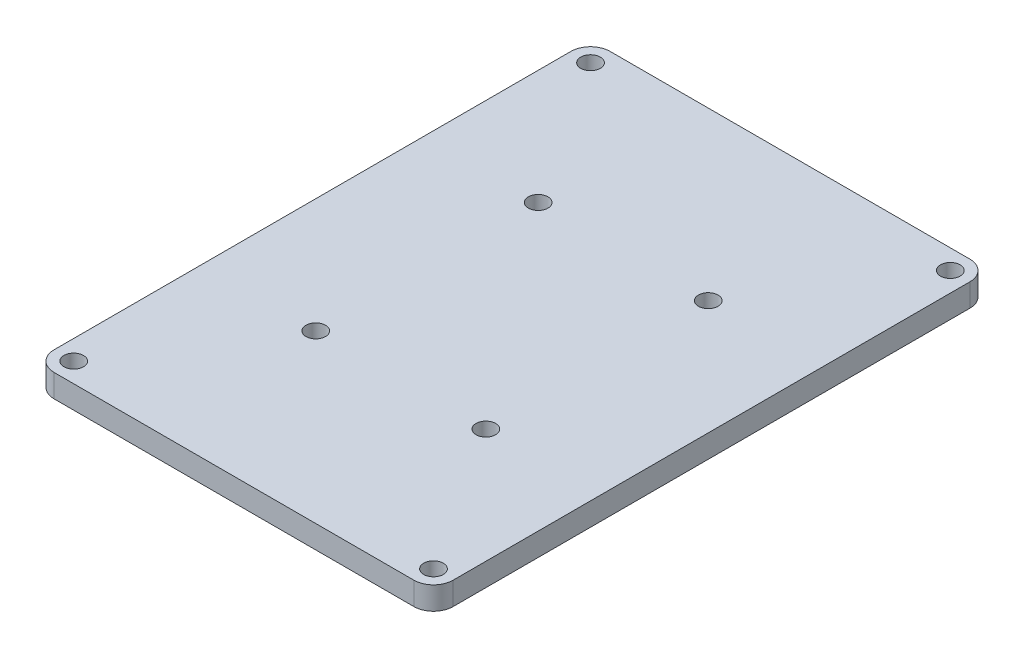
ISO-10303-21;
HEADER;
FILE_DESCRIPTION(('STEP AP214'),'2;1');
FILE_NAME('part.step','',(''),(''),'','','');
FILE_SCHEMA(('AUTOMOTIVE_DESIGN { 1 0 10303 214 1 1 1 1 }'));
ENDSEC;
DATA;
#1=APPLICATION_CONTEXT('core data for automotive mechanical design processes');
#2=APPLICATION_PROTOCOL_DEFINITION('international standard','automotive_design',2000,#1);
#3=PRODUCT_CONTEXT('',#1,'mechanical');
#4=PRODUCT('Part','Part','',(#3));
#5=PRODUCT_RELATED_PRODUCT_CATEGORY('part','',(#4));
#6=PRODUCT_DEFINITION_FORMATION('','',#4);
#7=PRODUCT_DEFINITION_CONTEXT('part definition',#1,'design');
#8=PRODUCT_DEFINITION('design','',#6,#7);
#9=PRODUCT_DEFINITION_SHAPE('','',#8);
#10=(LENGTH_UNIT() NAMED_UNIT(*) SI_UNIT(.MILLI.,.METRE.));
#11=(NAMED_UNIT(*) PLANE_ANGLE_UNIT() SI_UNIT($,.RADIAN.));
#12=(NAMED_UNIT(*) SI_UNIT($,.STERADIAN.) SOLID_ANGLE_UNIT());
#13=UNCERTAINTY_MEASURE_WITH_UNIT(LENGTH_MEASURE(1.E-05),#10,'distance_accuracy_value','');
#14=(GEOMETRIC_REPRESENTATION_CONTEXT(3) GLOBAL_UNCERTAINTY_ASSIGNED_CONTEXT((#13)) GLOBAL_UNIT_ASSIGNED_CONTEXT((#10,
#11,#12)) REPRESENTATION_CONTEXT('',''));
#15=CARTESIAN_POINT('',(0.,0.,0.));
#16=DIRECTION('',(0.,0.,1.));
#17=DIRECTION('',(1.,0.,0.));
#18=AXIS2_PLACEMENT_3D('',#15,#16,#17);
#19=CARTESIAN_POINT('',(30.5,3.5,-42.5));
#20=DIRECTION('',(-1.,0.,0.));
#21=DIRECTION('',(0.,0.,1.));
#22=AXIS2_PLACEMENT_3D('',#19,#20,#21);
#23=PLANE('',#22);
#24=DIRECTION('',(0.,0.,-1.));
#25=VECTOR('',#24,1.);
#26=CARTESIAN_POINT('',(30.5,0.,-42.5));
#27=LINE('',#26,#25);
#28=CARTESIAN_POINT('',(30.5,0.,39.5));
#29=VERTEX_POINT('',#28);
#30=CARTESIAN_POINT('',(30.5,0.,-39.5));
#31=VERTEX_POINT('',#30);
#32=EDGE_CURVE('E128',#29,#31,#27,.T.);
#33=ORIENTED_EDGE('',*,*,#32,.T.);
#34=DIRECTION('',(0.,-1.,0.));
#35=VECTOR('',#34,1.);
#36=CARTESIAN_POINT('',(30.5,3.5,-39.5));
#37=LINE('',#36,#35);
#38=CARTESIAN_POINT('',(30.5,3.5,-39.5));
#39=VERTEX_POINT('',#38);
#40=EDGE_CURVE('E151',#31,#39,#37,.F.);
#41=ORIENTED_EDGE('',*,*,#40,.T.);
#42=DIRECTION('',(0.,0.,-1.));
#43=VECTOR('',#42,1.);
#44=CARTESIAN_POINT('',(30.5,3.5,-42.5));
#45=LINE('',#44,#43);
#46=CARTESIAN_POINT('',(30.5,3.5,39.5));
#47=VERTEX_POINT('',#46);
#48=EDGE_CURVE('E126',#47,#39,#45,.T.);
#49=ORIENTED_EDGE('',*,*,#48,.F.);
#50=DIRECTION('',(0.,-1.,0.));
#51=VECTOR('',#50,1.);
#52=CARTESIAN_POINT('',(30.5,3.5,39.5));
#53=LINE('',#52,#51);
#54=EDGE_CURVE('E148',#47,#29,#53,.T.);
#55=ORIENTED_EDGE('',*,*,#54,.T.);
#56=EDGE_LOOP('',(#33,#41,#49,#55));
#57=FACE_BOUND('',#56,.T.);
#58=ADVANCED_FACE('F33',(#57),#23,.F.);
#59=CARTESIAN_POINT('',(-30.5,3.5,-42.5));
#60=DIRECTION('',(0.,0.,1.));
#61=DIRECTION('',(1.,0.,0.));
#62=AXIS2_PLACEMENT_3D('',#59,#60,#61);
#63=PLANE('',#62);
#64=DIRECTION('',(-1.,0.,0.));
#65=VECTOR('',#64,1.);
#66=CARTESIAN_POINT('',(-30.5,0.,-42.5));
#67=LINE('',#66,#65);
#68=CARTESIAN_POINT('',(27.5,0.,-42.5));
#69=VERTEX_POINT('',#68);
#70=CARTESIAN_POINT('',(-27.5,0.,-42.5));
#71=VERTEX_POINT('',#70);
#72=EDGE_CURVE('E124',#69,#71,#67,.T.);
#73=ORIENTED_EDGE('',*,*,#72,.T.);
#74=DIRECTION('',(0.,-1.,0.));
#75=VECTOR('',#74,1.);
#76=CARTESIAN_POINT('',(-27.5,3.5,-42.5));
#77=LINE('',#76,#75);
#78=CARTESIAN_POINT('',(-27.5,3.5,-42.5));
#79=VERTEX_POINT('',#78);
#80=EDGE_CURVE('E103',#71,#79,#77,.F.);
#81=ORIENTED_EDGE('',*,*,#80,.T.);
#82=DIRECTION('',(-1.,0.,0.));
#83=VECTOR('',#82,1.);
#84=CARTESIAN_POINT('',(-30.5,3.5,-42.5));
#85=LINE('',#84,#83);
#86=CARTESIAN_POINT('',(27.5,3.5,-42.5));
#87=VERTEX_POINT('',#86);
#88=EDGE_CURVE('E167',#87,#79,#85,.T.);
#89=ORIENTED_EDGE('',*,*,#88,.F.);
#90=DIRECTION('',(0.,-1.,0.));
#91=VECTOR('',#90,1.);
#92=CARTESIAN_POINT('',(27.5,3.5,-42.5));
#93=LINE('',#92,#91);
#94=EDGE_CURVE('E108',#87,#69,#93,.T.);
#95=ORIENTED_EDGE('',*,*,#94,.T.);
#96=EDGE_LOOP('',(#73,#81,#89,#95));
#97=FACE_BOUND('',#96,.T.);
#98=ADVANCED_FACE('F252',(#97),#63,.F.);
#99=CARTESIAN_POINT('',(-30.5,3.5,-42.5));
#100=DIRECTION('',(1.,0.,0.));
#101=DIRECTION('',(0.,0.,-1.));
#102=AXIS2_PLACEMENT_3D('',#99,#100,#101);
#103=PLANE('',#102);
#104=DIRECTION('',(0.,0.,1.));
#105=VECTOR('',#104,1.);
#106=CARTESIAN_POINT('',(-30.5,3.5,-42.5));
#107=LINE('',#106,#105);
#108=CARTESIAN_POINT('',(-30.5,3.5,-39.5));
#109=VERTEX_POINT('',#108);
#110=CARTESIAN_POINT('',(-30.5,3.5,39.5));
#111=VERTEX_POINT('',#110);
#112=EDGE_CURVE('E117',#109,#111,#107,.T.);
#113=ORIENTED_EDGE('',*,*,#112,.F.);
#114=DIRECTION('',(0.,-1.,0.));
#115=VECTOR('',#114,1.);
#116=CARTESIAN_POINT('',(-30.5,3.5,-39.5));
#117=LINE('',#116,#115);
#118=CARTESIAN_POINT('',(-30.5,0.,-39.5));
#119=VERTEX_POINT('',#118);
#120=EDGE_CURVE('E102',#109,#119,#117,.T.);
#121=ORIENTED_EDGE('',*,*,#120,.T.);
#122=DIRECTION('',(0.,0.,1.));
#123=VECTOR('',#122,1.);
#124=CARTESIAN_POINT('',(-30.5,0.,-42.5));
#125=LINE('',#124,#123);
#126=CARTESIAN_POINT('',(-30.5,0.,39.5));
#127=VERTEX_POINT('',#126);
#128=EDGE_CURVE('E115',#119,#127,#125,.T.);
#129=ORIENTED_EDGE('',*,*,#128,.T.);
#130=DIRECTION('',(0.,-1.,0.));
#131=VECTOR('',#130,1.);
#132=CARTESIAN_POINT('',(-30.5,3.5,39.5));
#133=LINE('',#132,#131);
#134=EDGE_CURVE('E119',#127,#111,#133,.F.);
#135=ORIENTED_EDGE('',*,*,#134,.T.);
#136=EDGE_LOOP('',(#113,#121,#129,#135));
#137=FACE_BOUND('',#136,.T.);
#138=ADVANCED_FACE('F114',(#137),#103,.F.);
#139=CARTESIAN_POINT('',(-30.5,3.5,42.5));
#140=DIRECTION('',(0.,0.,-1.));
#141=DIRECTION('',(-1.,0.,0.));
#142=AXIS2_PLACEMENT_3D('',#139,#140,#141);
#143=PLANE('',#142);
#144=DIRECTION('',(1.,0.,0.));
#145=VECTOR('',#144,1.);
#146=CARTESIAN_POINT('',(-30.5,0.,42.5));
#147=LINE('',#146,#145);
#148=CARTESIAN_POINT('',(-27.5,0.,42.5));
#149=VERTEX_POINT('',#148);
#150=CARTESIAN_POINT('',(27.5,0.,42.5));
#151=VERTEX_POINT('',#150);
#152=EDGE_CURVE('E123',#149,#151,#147,.T.);
#153=ORIENTED_EDGE('',*,*,#152,.T.);
#154=DIRECTION('',(0.,-1.,0.));
#155=VECTOR('',#154,1.);
#156=CARTESIAN_POINT('',(27.5,3.5,42.5));
#157=LINE('',#156,#155);
#158=CARTESIAN_POINT('',(27.5,3.5,42.5));
#159=VERTEX_POINT('',#158);
#160=EDGE_CURVE('E11',#151,#159,#157,.F.);
#161=ORIENTED_EDGE('',*,*,#160,.T.);
#162=DIRECTION('',(1.,0.,0.));
#163=VECTOR('',#162,1.);
#164=CARTESIAN_POINT('',(-30.5,3.5,42.5));
#165=LINE('',#164,#163);
#166=CARTESIAN_POINT('',(-27.5,3.5,42.5));
#167=VERTEX_POINT('',#166);
#168=EDGE_CURVE('E132',#167,#159,#165,.T.);
#169=ORIENTED_EDGE('',*,*,#168,.F.);
#170=DIRECTION('',(0.,-1.,0.));
#171=VECTOR('',#170,1.);
#172=CARTESIAN_POINT('',(-27.5,3.5,42.5));
#173=LINE('',#172,#171);
#174=EDGE_CURVE('E41',#167,#149,#173,.T.);
#175=ORIENTED_EDGE('',*,*,#174,.T.);
#176=EDGE_LOOP('',(#153,#161,#169,#175));
#177=FACE_BOUND('',#176,.T.);
#178=ADVANCED_FACE('F154',(#177),#143,.F.);
#179=CARTESIAN_POINT('',(0.,3.5,0.));
#180=DIRECTION('',(0.,1.,0.));
#181=DIRECTION('',(0.,0.,1.));
#182=AXIS2_PLACEMENT_3D('',#179,#180,#181);
#183=PLANE('',#182);
#184=CARTESIAN_POINT('',(-13.,3.5,17.));
#185=DIRECTION('',(0.,1.,0.));
#186=DIRECTION('',(0.,0.,1.));
#187=AXIS2_PLACEMENT_3D('',#184,#185,#186);
#188=CIRCLE('',#187,1.5);
#189=CARTESIAN_POINT('',(-13.,3.5,18.5));
#190=VERTEX_POINT('',#189);
#191=EDGE_CURVE('E207',#190,#190,#188,.T.);
#192=ORIENTED_EDGE('',*,*,#191,.F.);
#193=EDGE_LOOP('',(#192));
#194=FACE_BOUND('',#193,.T.);
#195=CARTESIAN_POINT('',(13.,3.5,-17.));
#196=DIRECTION('',(0.,1.,0.));
#197=DIRECTION('',(0.,0.,1.));
#198=AXIS2_PLACEMENT_3D('',#195,#196,#197);
#199=CIRCLE('',#198,1.5);
#200=CARTESIAN_POINT('',(13.,3.5,-15.5));
#201=VERTEX_POINT('',#200);
#202=EDGE_CURVE('E213',#201,#201,#199,.T.);
#203=ORIENTED_EDGE('',*,*,#202,.F.);
#204=EDGE_LOOP('',(#203));
#205=FACE_BOUND('',#204,.T.);
#206=CARTESIAN_POINT('',(13.,3.5,17.));
#207=DIRECTION('',(0.,1.,0.));
#208=DIRECTION('',(0.,0.,1.));
#209=AXIS2_PLACEMENT_3D('',#206,#207,#208);
#210=CIRCLE('',#209,1.5);
#211=CARTESIAN_POINT('',(13.,3.5,18.5));
#212=VERTEX_POINT('',#211);
#213=EDGE_CURVE('E219',#212,#212,#210,.T.);
#214=ORIENTED_EDGE('',*,*,#213,.F.);
#215=EDGE_LOOP('',(#214));
#216=FACE_BOUND('',#215,.T.);
#217=CARTESIAN_POINT('',(-13.,3.5,-17.));
#218=DIRECTION('',(0.,1.,0.));
#219=DIRECTION('',(0.,0.,1.));
#220=AXIS2_PLACEMENT_3D('',#217,#218,#219);
#221=CIRCLE('',#220,1.5);
#222=CARTESIAN_POINT('',(-13.,3.5,-15.5));
#223=VERTEX_POINT('',#222);
#224=EDGE_CURVE('E201',#223,#223,#221,.T.);
#225=ORIENTED_EDGE('',*,*,#224,.F.);
#226=EDGE_LOOP('',(#225));
#227=FACE_BOUND('',#226,.T.);
#228=CARTESIAN_POINT('',(27.5,3.5,-39.5));
#229=DIRECTION('',(0.,1.,0.));
#230=DIRECTION('',(0.,0.,1.));
#231=AXIS2_PLACEMENT_3D('',#228,#229,#230);
#232=CIRCLE('',#231,1.5);
#233=CARTESIAN_POINT('',(27.5,3.5,-38.));
#234=VERTEX_POINT('',#233);
#235=EDGE_CURVE('E190',#234,#234,#232,.T.);
#236=ORIENTED_EDGE('',*,*,#235,.F.);
#237=EDGE_LOOP('',(#236));
#238=FACE_BOUND('',#237,.T.);
#239=CARTESIAN_POINT('',(-27.5,3.5,39.5));
#240=DIRECTION('',(0.,1.,0.));
#241=DIRECTION('',(0.,0.,1.));
#242=AXIS2_PLACEMENT_3D('',#239,#240,#241);
#243=CIRCLE('',#242,1.5);
#244=CARTESIAN_POINT('',(-27.5,3.5,41.));
#245=VERTEX_POINT('',#244);
#246=EDGE_CURVE('E183',#245,#245,#243,.T.);
#247=ORIENTED_EDGE('',*,*,#246,.F.);
#248=EDGE_LOOP('',(#247));
#249=FACE_BOUND('',#248,.T.);
#250=CARTESIAN_POINT('',(27.5,3.5,39.5));
#251=DIRECTION('',(0.,1.,0.));
#252=DIRECTION('',(0.,0.,1.));
#253=AXIS2_PLACEMENT_3D('',#250,#251,#252);
#254=CIRCLE('',#253,1.5);
#255=CARTESIAN_POINT('',(27.5,3.5,41.));
#256=VERTEX_POINT('',#255);
#257=EDGE_CURVE('E195',#256,#256,#254,.T.);
#258=ORIENTED_EDGE('',*,*,#257,.F.);
#259=EDGE_LOOP('',(#258));
#260=FACE_BOUND('',#259,.T.);
#261=CARTESIAN_POINT('',(-27.5,3.5,-39.5));
#262=DIRECTION('',(0.,1.,0.));
#263=DIRECTION('',(0.,0.,1.));
#264=AXIS2_PLACEMENT_3D('',#261,#262,#263);
#265=CIRCLE('',#264,1.5);
#266=CARTESIAN_POINT('',(-27.5,3.5,-38.));
#267=VERTEX_POINT('',#266);
#268=EDGE_CURVE('E172',#267,#267,#265,.T.);
#269=ORIENTED_EDGE('',*,*,#268,.F.);
#270=EDGE_LOOP('',(#269));
#271=FACE_BOUND('',#270,.T.);
#272=ORIENTED_EDGE('',*,*,#88,.T.);
#273=CARTESIAN_POINT('',(-27.5,3.5,-39.5));
#274=DIRECTION('',(0.,1.,0.));
#275=DIRECTION('',(0.,0.,1.));
#276=AXIS2_PLACEMENT_3D('',#273,#274,#275);
#277=CIRCLE('',#276,3.);
#278=EDGE_CURVE('E146',#79,#109,#277,.T.);
#279=ORIENTED_EDGE('',*,*,#278,.T.);
#280=ORIENTED_EDGE('',*,*,#112,.T.);
#281=CARTESIAN_POINT('',(-27.5,3.5,39.5));
#282=DIRECTION('',(0.,1.,0.));
#283=DIRECTION('',(0.,0.,1.));
#284=AXIS2_PLACEMENT_3D('',#281,#282,#283);
#285=CIRCLE('',#284,3.);
#286=EDGE_CURVE('E53',#111,#167,#285,.T.);
#287=ORIENTED_EDGE('',*,*,#286,.T.);
#288=ORIENTED_EDGE('',*,*,#168,.T.);
#289=CARTESIAN_POINT('',(27.5,3.5,39.5));
#290=DIRECTION('',(0.,1.,0.));
#291=DIRECTION('',(0.,0.,1.));
#292=AXIS2_PLACEMENT_3D('',#289,#290,#291);
#293=CIRCLE('',#292,3.);
#294=EDGE_CURVE('E142',#159,#47,#293,.T.);
#295=ORIENTED_EDGE('',*,*,#294,.T.);
#296=ORIENTED_EDGE('',*,*,#48,.T.);
#297=CARTESIAN_POINT('',(27.5,3.5,-39.5));
#298=DIRECTION('',(0.,1.,0.));
#299=DIRECTION('',(0.,0.,1.));
#300=AXIS2_PLACEMENT_3D('',#297,#298,#299);
#301=CIRCLE('',#300,3.);
#302=EDGE_CURVE('E144',#39,#87,#301,.T.);
#303=ORIENTED_EDGE('',*,*,#302,.T.);
#304=EDGE_LOOP('',(#272,#279,#280,#287,#288,#295,#296,#303));
#305=FACE_BOUND('',#304,.T.);
#306=ADVANCED_FACE('F235',(#194,#205,#216,#227,#238,#249,#260,#271,#305),#183,.T.);
#307=CARTESIAN_POINT('',(0.,0.,0.));
#308=DIRECTION('',(0.,1.,0.));
#309=DIRECTION('',(0.,0.,1.));
#310=AXIS2_PLACEMENT_3D('',#307,#308,#309);
#311=PLANE('',#310);
#312=CARTESIAN_POINT('',(-13.,0.,17.));
#313=DIRECTION('',(0.,1.,0.));
#314=DIRECTION('',(0.,0.,1.));
#315=AXIS2_PLACEMENT_3D('',#312,#313,#314);
#316=CIRCLE('',#315,1.5);
#317=CARTESIAN_POINT('',(-13.,0.,18.5));
#318=VERTEX_POINT('',#317);
#319=EDGE_CURVE('E210',#318,#318,#316,.T.);
#320=ORIENTED_EDGE('',*,*,#319,.T.);
#321=EDGE_LOOP('',(#320));
#322=FACE_BOUND('',#321,.T.);
#323=CARTESIAN_POINT('',(13.,0.,-17.));
#324=DIRECTION('',(0.,1.,0.));
#325=DIRECTION('',(0.,0.,1.));
#326=AXIS2_PLACEMENT_3D('',#323,#324,#325);
#327=CIRCLE('',#326,1.5);
#328=CARTESIAN_POINT('',(13.,0.,-15.5));
#329=VERTEX_POINT('',#328);
#330=EDGE_CURVE('E216',#329,#329,#327,.T.);
#331=ORIENTED_EDGE('',*,*,#330,.T.);
#332=EDGE_LOOP('',(#331));
#333=FACE_BOUND('',#332,.T.);
#334=CARTESIAN_POINT('',(13.,0.,17.));
#335=DIRECTION('',(0.,1.,0.));
#336=DIRECTION('',(0.,0.,1.));
#337=AXIS2_PLACEMENT_3D('',#334,#335,#336);
#338=CIRCLE('',#337,1.5);
#339=CARTESIAN_POINT('',(13.,0.,18.5));
#340=VERTEX_POINT('',#339);
#341=EDGE_CURVE('E204',#340,#340,#338,.T.);
#342=ORIENTED_EDGE('',*,*,#341,.T.);
#343=EDGE_LOOP('',(#342));
#344=FACE_BOUND('',#343,.T.);
#345=CARTESIAN_POINT('',(-13.,0.,-17.));
#346=DIRECTION('',(0.,1.,0.));
#347=DIRECTION('',(0.,0.,1.));
#348=AXIS2_PLACEMENT_3D('',#345,#346,#347);
#349=CIRCLE('',#348,1.5);
#350=CARTESIAN_POINT('',(-13.,0.,-15.5));
#351=VERTEX_POINT('',#350);
#352=EDGE_CURVE('E198',#351,#351,#349,.T.);
#353=ORIENTED_EDGE('',*,*,#352,.T.);
#354=EDGE_LOOP('',(#353));
#355=FACE_BOUND('',#354,.T.);
#356=CARTESIAN_POINT('',(27.5,0.,-39.5));
#357=DIRECTION('',(0.,1.,0.));
#358=DIRECTION('',(0.,0.,1.));
#359=AXIS2_PLACEMENT_3D('',#356,#357,#358);
#360=CIRCLE('',#359,1.5);
#361=CARTESIAN_POINT('',(27.5,0.,-38.));
#362=VERTEX_POINT('',#361);
#363=EDGE_CURVE('E181',#362,#362,#360,.T.);
#364=ORIENTED_EDGE('',*,*,#363,.T.);
#365=EDGE_LOOP('',(#364));
#366=FACE_BOUND('',#365,.T.);
#367=CARTESIAN_POINT('',(-27.5,0.,39.5));
#368=DIRECTION('',(0.,1.,0.));
#369=DIRECTION('',(0.,0.,1.));
#370=AXIS2_PLACEMENT_3D('',#367,#368,#369);
#371=CIRCLE('',#370,1.5);
#372=CARTESIAN_POINT('',(-27.5,0.,41.));
#373=VERTEX_POINT('',#372);
#374=EDGE_CURVE('E186',#373,#373,#371,.T.);
#375=ORIENTED_EDGE('',*,*,#374,.T.);
#376=EDGE_LOOP('',(#375));
#377=FACE_BOUND('',#376,.T.);
#378=CARTESIAN_POINT('',(27.5,0.,39.5));
#379=DIRECTION('',(0.,1.,0.));
#380=DIRECTION('',(0.,0.,1.));
#381=AXIS2_PLACEMENT_3D('',#378,#379,#380);
#382=CIRCLE('',#381,1.5);
#383=CARTESIAN_POINT('',(27.5,0.,41.));
#384=VERTEX_POINT('',#383);
#385=EDGE_CURVE('E187',#384,#384,#382,.T.);
#386=ORIENTED_EDGE('',*,*,#385,.T.);
#387=EDGE_LOOP('',(#386));
#388=FACE_BOUND('',#387,.T.);
#389=CARTESIAN_POINT('',(-27.5,0.,-39.5));
#390=DIRECTION('',(0.,1.,0.));
#391=DIRECTION('',(0.,0.,1.));
#392=AXIS2_PLACEMENT_3D('',#389,#390,#391);
#393=CIRCLE('',#392,1.5);
#394=CARTESIAN_POINT('',(-27.5,0.,-38.));
#395=VERTEX_POINT('',#394);
#396=EDGE_CURVE('E176',#395,#395,#393,.T.);
#397=ORIENTED_EDGE('',*,*,#396,.T.);
#398=EDGE_LOOP('',(#397));
#399=FACE_BOUND('',#398,.T.);
#400=ORIENTED_EDGE('',*,*,#128,.F.);
#401=CARTESIAN_POINT('',(-27.5,0.,-39.5));
#402=DIRECTION('',(0.,1.,0.));
#403=DIRECTION('',(0.,0.,1.));
#404=AXIS2_PLACEMENT_3D('',#401,#402,#403);
#405=CIRCLE('',#404,3.);
#406=EDGE_CURVE('E98',#119,#71,#405,.F.);
#407=ORIENTED_EDGE('',*,*,#406,.T.);
#408=ORIENTED_EDGE('',*,*,#72,.F.);
#409=CARTESIAN_POINT('',(27.5,0.,-39.5));
#410=DIRECTION('',(0.,1.,0.));
#411=DIRECTION('',(0.,0.,1.));
#412=AXIS2_PLACEMENT_3D('',#409,#410,#411);
#413=CIRCLE('',#412,3.);
#414=EDGE_CURVE('E109',#69,#31,#413,.F.);
#415=ORIENTED_EDGE('',*,*,#414,.T.);
#416=ORIENTED_EDGE('',*,*,#32,.F.);
#417=CARTESIAN_POINT('',(27.5,0.,39.5));
#418=DIRECTION('',(0.,1.,0.));
#419=DIRECTION('',(0.,0.,1.));
#420=AXIS2_PLACEMENT_3D('',#417,#418,#419);
#421=CIRCLE('',#420,3.);
#422=EDGE_CURVE('E135',#29,#151,#421,.F.);
#423=ORIENTED_EDGE('',*,*,#422,.T.);
#424=ORIENTED_EDGE('',*,*,#152,.F.);
#425=CARTESIAN_POINT('',(-27.5,0.,39.5));
#426=DIRECTION('',(0.,1.,0.));
#427=DIRECTION('',(0.,0.,1.));
#428=AXIS2_PLACEMENT_3D('',#425,#426,#427);
#429=CIRCLE('',#428,3.);
#430=EDGE_CURVE('E118',#149,#127,#429,.F.);
#431=ORIENTED_EDGE('',*,*,#430,.T.);
#432=EDGE_LOOP('',(#400,#407,#408,#415,#416,#423,#424,#431));
#433=FACE_BOUND('',#432,.T.);
#434=ADVANCED_FACE('F121',(#322,#333,#344,#355,#366,#377,#388,#399,#433),#311,.F.);
#435=CARTESIAN_POINT('',(-27.5,0.,-39.5));
#436=DIRECTION('',(0.,1.,0.));
#437=DIRECTION('',(0.,0.,1.));
#438=AXIS2_PLACEMENT_3D('',#435,#436,#437);
#439=CYLINDRICAL_SURFACE('',#438,1.5);
#440=ORIENTED_EDGE('',*,*,#396,.F.);
#441=EDGE_LOOP('',(#440));
#442=FACE_BOUND('',#441,.T.);
#443=ORIENTED_EDGE('',*,*,#268,.T.);
#444=EDGE_LOOP('',(#443));
#445=FACE_BOUND('',#444,.T.);
#446=ADVANCED_FACE('F275',(#442,#445),#439,.F.);
#447=CARTESIAN_POINT('',(27.5,0.,39.5));
#448=DIRECTION('',(0.,1.,0.));
#449=DIRECTION('',(0.,0.,1.));
#450=AXIS2_PLACEMENT_3D('',#447,#448,#449);
#451=CYLINDRICAL_SURFACE('',#450,1.5);
#452=ORIENTED_EDGE('',*,*,#385,.F.);
#453=EDGE_LOOP('',(#452));
#454=FACE_BOUND('',#453,.T.);
#455=ORIENTED_EDGE('',*,*,#257,.T.);
#456=EDGE_LOOP('',(#455));
#457=FACE_BOUND('',#456,.T.);
#458=ADVANCED_FACE('F280',(#454,#457),#451,.F.);
#459=CARTESIAN_POINT('',(-27.5,0.,39.5));
#460=DIRECTION('',(0.,1.,0.));
#461=DIRECTION('',(0.,0.,1.));
#462=AXIS2_PLACEMENT_3D('',#459,#460,#461);
#463=CYLINDRICAL_SURFACE('',#462,1.5);
#464=ORIENTED_EDGE('',*,*,#374,.F.);
#465=EDGE_LOOP('',(#464));
#466=FACE_BOUND('',#465,.T.);
#467=ORIENTED_EDGE('',*,*,#246,.T.);
#468=EDGE_LOOP('',(#467));
#469=FACE_BOUND('',#468,.T.);
#470=ADVANCED_FACE('F282',(#466,#469),#463,.F.);
#471=CARTESIAN_POINT('',(27.5,0.,-39.5));
#472=DIRECTION('',(0.,1.,0.));
#473=DIRECTION('',(0.,0.,1.));
#474=AXIS2_PLACEMENT_3D('',#471,#472,#473);
#475=CYLINDRICAL_SURFACE('',#474,1.5);
#476=ORIENTED_EDGE('',*,*,#363,.F.);
#477=EDGE_LOOP('',(#476));
#478=FACE_BOUND('',#477,.T.);
#479=ORIENTED_EDGE('',*,*,#235,.T.);
#480=EDGE_LOOP('',(#479));
#481=FACE_BOUND('',#480,.T.);
#482=ADVANCED_FACE('F285',(#478,#481),#475,.F.);
#483=CARTESIAN_POINT('',(-13.,0.,-17.));
#484=DIRECTION('',(0.,1.,0.));
#485=DIRECTION('',(0.,0.,1.));
#486=AXIS2_PLACEMENT_3D('',#483,#484,#485);
#487=CYLINDRICAL_SURFACE('',#486,1.5);
#488=ORIENTED_EDGE('',*,*,#352,.F.);
#489=EDGE_LOOP('',(#488));
#490=FACE_BOUND('',#489,.T.);
#491=ORIENTED_EDGE('',*,*,#224,.T.);
#492=EDGE_LOOP('',(#491));
#493=FACE_BOUND('',#492,.T.);
#494=ADVANCED_FACE('F231',(#490,#493),#487,.F.);
#495=CARTESIAN_POINT('',(13.,0.,17.));
#496=DIRECTION('',(0.,1.,0.));
#497=DIRECTION('',(0.,0.,1.));
#498=AXIS2_PLACEMENT_3D('',#495,#496,#497);
#499=CYLINDRICAL_SURFACE('',#498,1.5);
#500=ORIENTED_EDGE('',*,*,#341,.F.);
#501=EDGE_LOOP('',(#500));
#502=FACE_BOUND('',#501,.T.);
#503=ORIENTED_EDGE('',*,*,#213,.T.);
#504=EDGE_LOOP('',(#503));
#505=FACE_BOUND('',#504,.T.);
#506=ADVANCED_FACE('F227',(#502,#505),#499,.F.);
#507=CARTESIAN_POINT('',(13.,0.,-17.));
#508=DIRECTION('',(0.,1.,0.));
#509=DIRECTION('',(0.,0.,1.));
#510=AXIS2_PLACEMENT_3D('',#507,#508,#509);
#511=CYLINDRICAL_SURFACE('',#510,1.5);
#512=ORIENTED_EDGE('',*,*,#330,.F.);
#513=EDGE_LOOP('',(#512));
#514=FACE_BOUND('',#513,.T.);
#515=ORIENTED_EDGE('',*,*,#202,.T.);
#516=EDGE_LOOP('',(#515));
#517=FACE_BOUND('',#516,.T.);
#518=ADVANCED_FACE('F230',(#514,#517),#511,.F.);
#519=CARTESIAN_POINT('',(-13.,0.,17.));
#520=DIRECTION('',(0.,1.,0.));
#521=DIRECTION('',(0.,0.,1.));
#522=AXIS2_PLACEMENT_3D('',#519,#520,#521);
#523=CYLINDRICAL_SURFACE('',#522,1.5);
#524=ORIENTED_EDGE('',*,*,#319,.F.);
#525=EDGE_LOOP('',(#524));
#526=FACE_BOUND('',#525,.T.);
#527=ORIENTED_EDGE('',*,*,#191,.T.);
#528=EDGE_LOOP('',(#527));
#529=FACE_BOUND('',#528,.T.);
#530=ADVANCED_FACE('F261',(#526,#529),#523,.F.);
#531=CARTESIAN_POINT('',(-27.5,3.5,-39.5));
#532=DIRECTION('',(0.,-1.,0.));
#533=DIRECTION('',(0.,0.,-1.));
#534=AXIS2_PLACEMENT_3D('',#531,#532,#533);
#535=CYLINDRICAL_SURFACE('',#534,3.);
#536=ORIENTED_EDGE('',*,*,#278,.F.);
#537=ORIENTED_EDGE('',*,*,#80,.F.);
#538=ORIENTED_EDGE('',*,*,#406,.F.);
#539=ORIENTED_EDGE('',*,*,#120,.F.);
#540=EDGE_LOOP('',(#536,#537,#538,#539));
#541=FACE_BOUND('',#540,.T.);
#542=ADVANCED_FACE('F101',(#541),#535,.T.);
#543=CARTESIAN_POINT('',(27.5,3.5,-39.5));
#544=DIRECTION('',(0.,-1.,0.));
#545=DIRECTION('',(0.,0.,-1.));
#546=AXIS2_PLACEMENT_3D('',#543,#544,#545);
#547=CYLINDRICAL_SURFACE('',#546,3.);
#548=ORIENTED_EDGE('',*,*,#302,.F.);
#549=ORIENTED_EDGE('',*,*,#40,.F.);
#550=ORIENTED_EDGE('',*,*,#414,.F.);
#551=ORIENTED_EDGE('',*,*,#94,.F.);
#552=EDGE_LOOP('',(#548,#549,#550,#551));
#553=FACE_BOUND('',#552,.T.);
#554=ADVANCED_FACE('F254',(#553),#547,.T.);
#555=CARTESIAN_POINT('',(27.5,3.5,39.5));
#556=DIRECTION('',(0.,-1.,0.));
#557=DIRECTION('',(0.,0.,-1.));
#558=AXIS2_PLACEMENT_3D('',#555,#556,#557);
#559=CYLINDRICAL_SURFACE('',#558,3.);
#560=ORIENTED_EDGE('',*,*,#294,.F.);
#561=ORIENTED_EDGE('',*,*,#160,.F.);
#562=ORIENTED_EDGE('',*,*,#422,.F.);
#563=ORIENTED_EDGE('',*,*,#54,.F.);
#564=EDGE_LOOP('',(#560,#561,#562,#563));
#565=FACE_BOUND('',#564,.T.);
#566=ADVANCED_FACE('F161',(#565),#559,.T.);
#567=CARTESIAN_POINT('',(-27.5,3.5,39.5));
#568=DIRECTION('',(0.,-1.,0.));
#569=DIRECTION('',(0.,0.,-1.));
#570=AXIS2_PLACEMENT_3D('',#567,#568,#569);
#571=CYLINDRICAL_SURFACE('',#570,3.);
#572=ORIENTED_EDGE('',*,*,#286,.F.);
#573=ORIENTED_EDGE('',*,*,#134,.F.);
#574=ORIENTED_EDGE('',*,*,#430,.F.);
#575=ORIENTED_EDGE('',*,*,#174,.F.);
#576=EDGE_LOOP('',(#572,#573,#574,#575));
#577=FACE_BOUND('',#576,.T.);
#578=ADVANCED_FACE('F35',(#577),#571,.T.);
#579=CLOSED_SHELL('',(#58,#98,#138,#178,#306,#434,#446,#458,#470,#482,#494,#506,#518,#530,#542,
#554,#566,#578));
#580=MANIFOLD_SOLID_BREP('B2',#579);
#581=ADVANCED_BREP_SHAPE_REPRESENTATION('',(#18,#580),#14);
#582=SHAPE_DEFINITION_REPRESENTATION(#9,#581);
ENDSEC;
END-ISO-10303-21;
